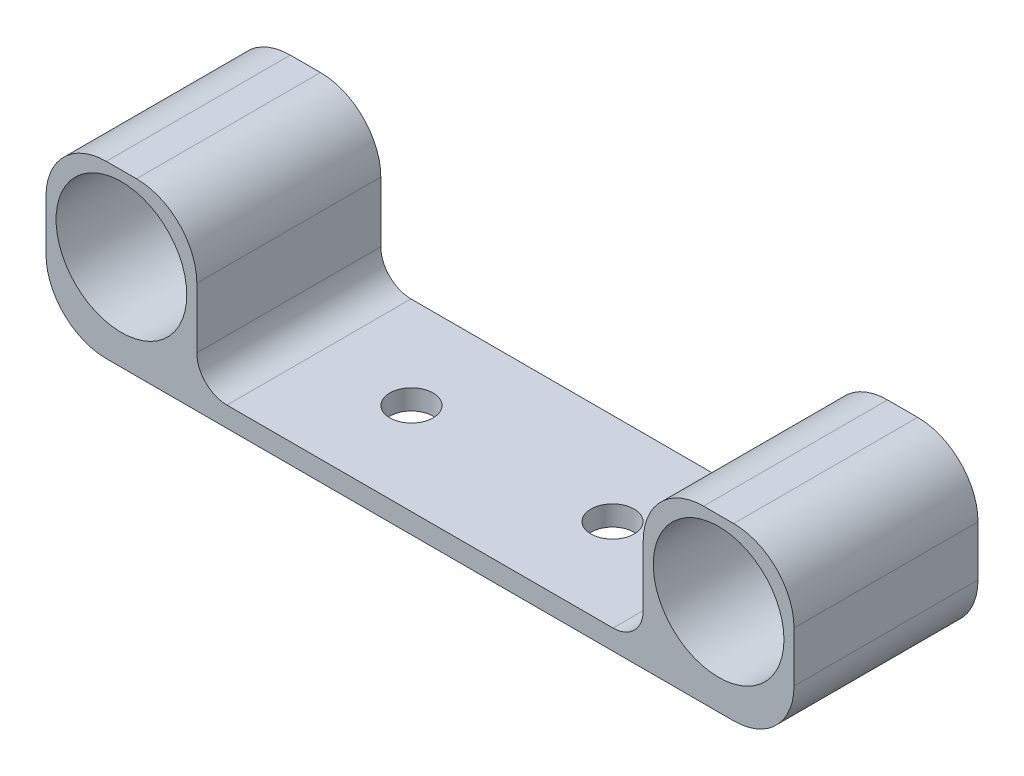
ISO-10303-21;
HEADER;
FILE_DESCRIPTION(('STEP AP214'),'2;1');
FILE_NAME('part.step','',(''),(''),'','','');
FILE_SCHEMA(('AUTOMOTIVE_DESIGN { 1 0 10303 214 1 1 1 1 }'));
ENDSEC;
DATA;
#1=APPLICATION_CONTEXT('core data for automotive mechanical design processes');
#2=APPLICATION_PROTOCOL_DEFINITION('international standard','automotive_design',2000,#1);
#3=PRODUCT_CONTEXT('',#1,'mechanical');
#4=PRODUCT('Part','Part','',(#3));
#5=PRODUCT_RELATED_PRODUCT_CATEGORY('part','',(#4));
#6=PRODUCT_DEFINITION_FORMATION('','',#4);
#7=PRODUCT_DEFINITION_CONTEXT('part definition',#1,'design');
#8=PRODUCT_DEFINITION('design','',#6,#7);
#9=PRODUCT_DEFINITION_SHAPE('','',#8);
#10=(LENGTH_UNIT() NAMED_UNIT(*) SI_UNIT(.MILLI.,.METRE.));
#11=(NAMED_UNIT(*) PLANE_ANGLE_UNIT() SI_UNIT($,.RADIAN.));
#12=(NAMED_UNIT(*) SI_UNIT($,.STERADIAN.) SOLID_ANGLE_UNIT());
#13=UNCERTAINTY_MEASURE_WITH_UNIT(LENGTH_MEASURE(1.E-05),#10,'distance_accuracy_value','');
#14=(GEOMETRIC_REPRESENTATION_CONTEXT(3) GLOBAL_UNCERTAINTY_ASSIGNED_CONTEXT((#13)) GLOBAL_UNIT_ASSIGNED_CONTEXT((#10,
#11,#12)) REPRESENTATION_CONTEXT('',''));
#15=CARTESIAN_POINT('',(0.,0.,0.));
#16=DIRECTION('',(0.,0.,1.));
#17=DIRECTION('',(1.,0.,0.));
#18=AXIS2_PLACEMENT_3D('',#15,#16,#17);
#19=CARTESIAN_POINT('',(0.,2.,0.));
#20=DIRECTION('',(0.,1.,0.));
#21=DIRECTION('',(0.,0.,1.));
#22=AXIS2_PLACEMENT_3D('',#19,#20,#21);
#23=PLANE('',#22);
#24=CARTESIAN_POINT('',(32.2,2.,-9.15));
#25=DIRECTION('',(0.,1.,0.));
#26=DIRECTION('',(0.,0.,1.));
#27=AXIS2_PLACEMENT_3D('',#24,#25,#26);
#28=CIRCLE('',#27,2.15);
#29=CARTESIAN_POINT('',(32.2,2.,-7.));
#30=VERTEX_POINT('',#29);
#31=EDGE_CURVE('E316',#30,#30,#28,.T.);
#32=ORIENTED_EDGE('',*,*,#31,.F.);
#33=EDGE_LOOP('',(#32));
#34=FACE_BOUND('',#33,.T.);
#35=CARTESIAN_POINT('',(12.2,2.,-9.15));
#36=DIRECTION('',(0.,1.,0.));
#37=DIRECTION('',(0.,0.,1.));
#38=AXIS2_PLACEMENT_3D('',#35,#36,#37);
#39=CIRCLE('',#38,2.15);
#40=CARTESIAN_POINT('',(12.2,2.,-7.));
#41=VERTEX_POINT('',#40);
#42=EDGE_CURVE('E326',#41,#41,#39,.T.);
#43=ORIENTED_EDGE('',*,*,#42,.F.);
#44=EDGE_LOOP('',(#43));
#45=FACE_BOUND('',#44,.T.);
#46=DIRECTION('',(-1.,0.,0.));
#47=VECTOR('',#46,1.);
#48=CARTESIAN_POINT('',(0.,2.,0.));
#49=LINE('',#48,#47);
#50=CARTESIAN_POINT('',(41.4,2.,0.));
#51=VERTEX_POINT('',#50);
#52=CARTESIAN_POINT('',(3.,2.,0.));
#53=VERTEX_POINT('',#52);
#54=EDGE_CURVE('E308',#51,#53,#49,.T.);
#55=ORIENTED_EDGE('',*,*,#54,.F.);
#56=DIRECTION('',(0.,0.,1.));
#57=VECTOR('',#56,1.);
#58=CARTESIAN_POINT('',(41.4,2.,-18.3));
#59=LINE('',#58,#57);
#60=CARTESIAN_POINT('',(41.4,2.,-18.3));
#61=VERTEX_POINT('',#60);
#62=EDGE_CURVE('E274',#51,#61,#59,.F.);
#63=ORIENTED_EDGE('',*,*,#62,.T.);
#64=DIRECTION('',(-1.,0.,0.));
#65=VECTOR('',#64,1.);
#66=CARTESIAN_POINT('',(0.,2.,-18.3));
#67=LINE('',#66,#65);
#68=CARTESIAN_POINT('',(3.,2.,-18.3));
#69=VERTEX_POINT('',#68);
#70=EDGE_CURVE('E291',#61,#69,#67,.T.);
#71=ORIENTED_EDGE('',*,*,#70,.T.);
#72=DIRECTION('',(0.,0.,1.));
#73=VECTOR('',#72,1.);
#74=CARTESIAN_POINT('',(3.,2.,0.));
#75=LINE('',#74,#73);
#76=EDGE_CURVE('E270',#69,#53,#75,.T.);
#77=ORIENTED_EDGE('',*,*,#76,.T.);
#78=EDGE_LOOP('',(#55,#63,#71,#77));
#79=FACE_BOUND('',#78,.T.);
#80=ADVANCED_FACE('F49',(#34,#45,#79),#23,.T.);
#81=CARTESIAN_POINT('',(-15.,2.,0.));
#82=DIRECTION('',(-1.,0.,0.));
#83=DIRECTION('',(0.,0.,1.));
#84=AXIS2_PLACEMENT_3D('',#81,#82,#83);
#85=PLANE('',#84);
#86=DIRECTION('',(0.,-1.,0.));
#87=VECTOR('',#86,1.);
#88=CARTESIAN_POINT('',(-15.,2.,-18.3));
#89=LINE('',#88,#87);
#90=CARTESIAN_POINT('',(-15.,11.,-18.3));
#91=VERTEX_POINT('',#90);
#92=CARTESIAN_POINT('',(-15.,6.,-18.3));
#93=VERTEX_POINT('',#92);
#94=EDGE_CURVE('E187',#91,#93,#89,.T.);
#95=ORIENTED_EDGE('',*,*,#94,.T.);
#96=DIRECTION('',(0.,0.,-1.));
#97=VECTOR('',#96,1.);
#98=CARTESIAN_POINT('',(-15.,6.,0.));
#99=LINE('',#98,#97);
#100=CARTESIAN_POINT('',(-15.,6.,0.));
#101=VERTEX_POINT('',#100);
#102=EDGE_CURVE('E253',#93,#101,#99,.F.);
#103=ORIENTED_EDGE('',*,*,#102,.T.);
#104=DIRECTION('',(0.,-1.,0.));
#105=VECTOR('',#104,1.);
#106=CARTESIAN_POINT('',(-15.,2.,0.));
#107=LINE('',#106,#105);
#108=CARTESIAN_POINT('',(-15.,11.,0.));
#109=VERTEX_POINT('',#108);
#110=EDGE_CURVE('E193',#109,#101,#107,.T.);
#111=ORIENTED_EDGE('',*,*,#110,.F.);
#112=DIRECTION('',(0.,0.,-1.));
#113=VECTOR('',#112,1.);
#114=CARTESIAN_POINT('',(-15.,11.,0.));
#115=LINE('',#114,#113);
#116=EDGE_CURVE('E249',#109,#91,#115,.T.);
#117=ORIENTED_EDGE('',*,*,#116,.T.);
#118=EDGE_LOOP('',(#95,#103,#111,#117));
#119=FACE_BOUND('',#118,.T.);
#120=ADVANCED_FACE('F358',(#119),#85,.T.);
#121=CARTESIAN_POINT('',(0.,2.,0.));
#122=DIRECTION('',(0.,0.,1.));
#123=DIRECTION('',(1.,0.,0.));
#124=AXIS2_PLACEMENT_3D('',#121,#122,#123);
#125=PLANE('',#124);
#126=CARTESIAN_POINT('',(-7.5,9.5,0.));
#127=DIRECTION('',(0.,0.,1.));
#128=DIRECTION('',(1.,0.,0.));
#129=AXIS2_PLACEMENT_3D('',#126,#127,#128);
#130=CIRCLE('',#129,6.5);
#131=CARTESIAN_POINT('',(-0.999999999999999,9.5,0.));
#132=VERTEX_POINT('',#131);
#133=EDGE_CURVE('E670',#132,#132,#130,.T.);
#134=ORIENTED_EDGE('',*,*,#133,.F.);
#135=EDGE_LOOP('',(#134));
#136=FACE_BOUND('',#135,.T.);
#137=CARTESIAN_POINT('',(51.9,9.5,0.));
#138=DIRECTION('',(0.,0.,1.));
#139=DIRECTION('',(1.,0.,0.));
#140=AXIS2_PLACEMENT_3D('',#137,#138,#139);
#141=CIRCLE('',#140,6.5);
#142=CARTESIAN_POINT('',(58.4,9.5,0.));
#143=VERTEX_POINT('',#142);
#144=EDGE_CURVE('E666',#143,#143,#141,.T.);
#145=ORIENTED_EDGE('',*,*,#144,.F.);
#146=EDGE_LOOP('',(#145));
#147=FACE_BOUND('',#146,.T.);
#148=DIRECTION('',(-1.,0.,0.));
#149=VECTOR('',#148,1.);
#150=CARTESIAN_POINT('',(0.,0.,0.));
#151=LINE('',#150,#149);
#152=CARTESIAN_POINT('',(53.4,0.,0.));
#153=VERTEX_POINT('',#152);
#154=CARTESIAN_POINT('',(-9.,0.,0.));
#155=VERTEX_POINT('',#154);
#156=EDGE_CURVE('E301',#153,#155,#151,.T.);
#157=ORIENTED_EDGE('',*,*,#156,.F.);
#158=CARTESIAN_POINT('',(53.4,6.,0.));
#159=DIRECTION('',(0.,0.,1.));
#160=DIRECTION('',(1.,0.,0.));
#161=AXIS2_PLACEMENT_3D('',#158,#159,#160);
#162=CIRCLE('',#161,6.);
#163=CARTESIAN_POINT('',(59.4,6.,0.));
#164=VERTEX_POINT('',#163);
#165=EDGE_CURVE('E236',#153,#164,#162,.T.);
#166=ORIENTED_EDGE('',*,*,#165,.T.);
#167=DIRECTION('',(0.,-1.,0.));
#168=VECTOR('',#167,1.);
#169=CARTESIAN_POINT('',(59.4,2.,0.));
#170=LINE('',#169,#168);
#171=CARTESIAN_POINT('',(59.4,11.,0.));
#172=VERTEX_POINT('',#171);
#173=EDGE_CURVE('E186',#172,#164,#170,.T.);
#174=ORIENTED_EDGE('',*,*,#173,.F.);
#175=CARTESIAN_POINT('',(53.4,11.,0.));
#176=DIRECTION('',(0.,0.,1.));
#177=DIRECTION('',(1.,0.,0.));
#178=AXIS2_PLACEMENT_3D('',#175,#176,#177);
#179=CIRCLE('',#178,6.);
#180=CARTESIAN_POINT('',(53.4,17.,0.));
#181=VERTEX_POINT('',#180);
#182=EDGE_CURVE('E191',#172,#181,#179,.T.);
#183=ORIENTED_EDGE('',*,*,#182,.T.);
#184=DIRECTION('',(1.,0.,0.));
#185=VECTOR('',#184,1.);
#186=CARTESIAN_POINT('',(0.,17.,0.));
#187=LINE('',#186,#185);
#188=CARTESIAN_POINT('',(50.4,17.,0.));
#189=VERTEX_POINT('',#188);
#190=EDGE_CURVE('E387',#189,#181,#187,.T.);
#191=ORIENTED_EDGE('',*,*,#190,.F.);
#192=CARTESIAN_POINT('',(50.4,11.,0.));
#193=DIRECTION('',(0.,0.,1.));
#194=DIRECTION('',(1.,0.,0.));
#195=AXIS2_PLACEMENT_3D('',#192,#193,#194);
#196=CIRCLE('',#195,6.);
#197=CARTESIAN_POINT('',(44.4,11.,0.));
#198=VERTEX_POINT('',#197);
#199=EDGE_CURVE('E231',#189,#198,#196,.T.);
#200=ORIENTED_EDGE('',*,*,#199,.T.);
#201=DIRECTION('',(0.,-1.,0.));
#202=VECTOR('',#201,1.);
#203=CARTESIAN_POINT('',(44.4,17.,0.));
#204=LINE('',#203,#202);
#205=CARTESIAN_POINT('',(44.4,5.,0.));
#206=VERTEX_POINT('',#205);
#207=EDGE_CURVE('E302',#198,#206,#204,.T.);
#208=ORIENTED_EDGE('',*,*,#207,.T.);
#209=CARTESIAN_POINT('',(41.4,5.,0.));
#210=DIRECTION('',(0.,0.,1.));
#211=DIRECTION('',(1.,0.,0.));
#212=AXIS2_PLACEMENT_3D('',#209,#210,#211);
#213=CIRCLE('',#212,3.);
#214=EDGE_CURVE('E279',#206,#51,#213,.F.);
#215=ORIENTED_EDGE('',*,*,#214,.T.);
#216=ORIENTED_EDGE('',*,*,#54,.T.);
#217=CARTESIAN_POINT('',(3.,5.,0.));
#218=DIRECTION('',(0.,0.,1.));
#219=DIRECTION('',(1.,0.,0.));
#220=AXIS2_PLACEMENT_3D('',#217,#218,#219);
#221=CIRCLE('',#220,3.);
#222=CARTESIAN_POINT('',(0.,5.,0.));
#223=VERTEX_POINT('',#222);
#224=EDGE_CURVE('E58',#53,#223,#221,.F.);
#225=ORIENTED_EDGE('',*,*,#224,.T.);
#226=DIRECTION('',(0.,-1.,0.));
#227=VECTOR('',#226,1.);
#228=CARTESIAN_POINT('',(0.,17.,0.));
#229=LINE('',#228,#227);
#230=CARTESIAN_POINT('',(0.,11.,0.));
#231=VERTEX_POINT('',#230);
#232=EDGE_CURVE('E379',#231,#223,#229,.T.);
#233=ORIENTED_EDGE('',*,*,#232,.F.);
#234=CARTESIAN_POINT('',(-6.,11.,0.));
#235=DIRECTION('',(0.,0.,1.));
#236=DIRECTION('',(1.,0.,0.));
#237=AXIS2_PLACEMENT_3D('',#234,#235,#236);
#238=CIRCLE('',#237,6.);
#239=CARTESIAN_POINT('',(-6.,17.,0.));
#240=VERTEX_POINT('',#239);
#241=EDGE_CURVE('E225',#231,#240,#238,.T.);
#242=ORIENTED_EDGE('',*,*,#241,.T.);
#243=DIRECTION('',(-1.,0.,0.));
#244=VECTOR('',#243,1.);
#245=CARTESIAN_POINT('',(0.,17.,0.));
#246=LINE('',#245,#244);
#247=CARTESIAN_POINT('',(-9.,17.,0.));
#248=VERTEX_POINT('',#247);
#249=EDGE_CURVE('E375',#240,#248,#246,.T.);
#250=ORIENTED_EDGE('',*,*,#249,.T.);
#251=CARTESIAN_POINT('',(-9.,11.,0.));
#252=DIRECTION('',(0.,0.,1.));
#253=DIRECTION('',(1.,0.,0.));
#254=AXIS2_PLACEMENT_3D('',#251,#252,#253);
#255=CIRCLE('',#254,6.);
#256=EDGE_CURVE('E222',#248,#109,#255,.T.);
#257=ORIENTED_EDGE('',*,*,#256,.T.);
#258=ORIENTED_EDGE('',*,*,#110,.T.);
#259=CARTESIAN_POINT('',(-9.,6.,0.));
#260=DIRECTION('',(0.,0.,1.));
#261=DIRECTION('',(1.,0.,0.));
#262=AXIS2_PLACEMENT_3D('',#259,#260,#261);
#263=CIRCLE('',#262,6.);
#264=EDGE_CURVE('E228',#101,#155,#263,.T.);
#265=ORIENTED_EDGE('',*,*,#264,.T.);
#266=EDGE_LOOP('',(#157,#166,#174,#183,#191,#200,#208,#215,#216,#225,#233,#242,#250,#257,#258,#265));
#267=FACE_BOUND('',#266,.T.);
#268=ADVANCED_FACE('F307',(#136,#147,#267),#125,.T.);
#269=CARTESIAN_POINT('',(59.4,2.,0.));
#270=DIRECTION('',(-1.,0.,0.));
#271=DIRECTION('',(0.,0.,1.));
#272=AXIS2_PLACEMENT_3D('',#269,#270,#271);
#273=PLANE('',#272);
#274=ORIENTED_EDGE('',*,*,#173,.T.);
#275=DIRECTION('',(0.,0.,-1.));
#276=VECTOR('',#275,1.);
#277=CARTESIAN_POINT('',(59.4,6.,0.));
#278=LINE('',#277,#276);
#279=CARTESIAN_POINT('',(59.4,6.,-18.3));
#280=VERTEX_POINT('',#279);
#281=EDGE_CURVE('E184',#164,#280,#278,.T.);
#282=ORIENTED_EDGE('',*,*,#281,.T.);
#283=DIRECTION('',(0.,-1.,0.));
#284=VECTOR('',#283,1.);
#285=CARTESIAN_POINT('',(59.4,2.,-18.3));
#286=LINE('',#285,#284);
#287=CARTESIAN_POINT('',(59.4,11.,-18.3));
#288=VERTEX_POINT('',#287);
#289=EDGE_CURVE('E166',#288,#280,#286,.T.);
#290=ORIENTED_EDGE('',*,*,#289,.F.);
#291=DIRECTION('',(0.,0.,-1.));
#292=VECTOR('',#291,1.);
#293=CARTESIAN_POINT('',(59.4,11.,0.));
#294=LINE('',#293,#292);
#295=EDGE_CURVE('E181',#288,#172,#294,.F.);
#296=ORIENTED_EDGE('',*,*,#295,.T.);
#297=EDGE_LOOP('',(#274,#282,#290,#296));
#298=FACE_BOUND('',#297,.T.);
#299=ADVANCED_FACE('F180',(#298),#273,.F.);
#300=CARTESIAN_POINT('',(32.2,2.,-9.15));
#301=DIRECTION('',(0.,-1.,0.));
#302=DIRECTION('',(0.,0.,-1.));
#303=AXIS2_PLACEMENT_3D('',#300,#301,#302);
#304=CYLINDRICAL_SURFACE('',#303,2.15);
#305=ORIENTED_EDGE('',*,*,#31,.T.);
#306=EDGE_LOOP('',(#305));
#307=FACE_BOUND('',#306,.T.);
#308=CARTESIAN_POINT('',(32.2,0.,-9.15));
#309=DIRECTION('',(0.,1.,0.));
#310=DIRECTION('',(0.,0.,1.));
#311=AXIS2_PLACEMENT_3D('',#308,#309,#310);
#312=CIRCLE('',#311,2.15);
#313=CARTESIAN_POINT('',(32.2,0.,-7.));
#314=VERTEX_POINT('',#313);
#315=EDGE_CURVE('E319',#314,#314,#312,.T.);
#316=ORIENTED_EDGE('',*,*,#315,.F.);
#317=EDGE_LOOP('',(#316));
#318=FACE_BOUND('',#317,.T.);
#319=ADVANCED_FACE('F429',(#307,#318),#304,.F.);
#320=CARTESIAN_POINT('',(0.,2.,-18.3));
#321=DIRECTION('',(0.,0.,1.));
#322=DIRECTION('',(1.,0.,0.));
#323=AXIS2_PLACEMENT_3D('',#320,#321,#322);
#324=PLANE('',#323);
#325=ORIENTED_EDGE('',*,*,#289,.T.);
#326=CARTESIAN_POINT('',(53.4,6.,-18.3));
#327=DIRECTION('',(0.,0.,1.));
#328=DIRECTION('',(1.,0.,0.));
#329=AXIS2_PLACEMENT_3D('',#326,#327,#328);
#330=CIRCLE('',#329,6.);
#331=CARTESIAN_POINT('',(53.4,0.,-18.3));
#332=VERTEX_POINT('',#331);
#333=EDGE_CURVE('E174',#280,#332,#330,.F.);
#334=ORIENTED_EDGE('',*,*,#333,.T.);
#335=DIRECTION('',(-1.,0.,0.));
#336=VECTOR('',#335,1.);
#337=CARTESIAN_POINT('',(0.,0.,-18.3));
#338=LINE('',#337,#336);
#339=CARTESIAN_POINT('',(-9.,0.,-18.3));
#340=VERTEX_POINT('',#339);
#341=EDGE_CURVE('E333',#332,#340,#338,.T.);
#342=ORIENTED_EDGE('',*,*,#341,.T.);
#343=CARTESIAN_POINT('',(-9.,6.,-18.3));
#344=DIRECTION('',(0.,0.,1.));
#345=DIRECTION('',(1.,0.,0.));
#346=AXIS2_PLACEMENT_3D('',#343,#344,#345);
#347=CIRCLE('',#346,6.);
#348=EDGE_CURVE('E208',#340,#93,#347,.F.);
#349=ORIENTED_EDGE('',*,*,#348,.T.);
#350=ORIENTED_EDGE('',*,*,#94,.F.);
#351=CARTESIAN_POINT('',(-9.,11.,-18.3));
#352=DIRECTION('',(0.,0.,1.));
#353=DIRECTION('',(1.,0.,0.));
#354=AXIS2_PLACEMENT_3D('',#351,#352,#353);
#355=CIRCLE('',#354,6.);
#356=CARTESIAN_POINT('',(-9.,17.,-18.3));
#357=VERTEX_POINT('',#356);
#358=EDGE_CURVE('E197',#91,#357,#355,.F.);
#359=ORIENTED_EDGE('',*,*,#358,.T.);
#360=DIRECTION('',(-1.,0.,0.));
#361=VECTOR('',#360,1.);
#362=CARTESIAN_POINT('',(0.,17.,-18.3));
#363=LINE('',#362,#361);
#364=CARTESIAN_POINT('',(-6.,17.,-18.3));
#365=VERTEX_POINT('',#364);
#366=EDGE_CURVE('E367',#365,#357,#363,.T.);
#367=ORIENTED_EDGE('',*,*,#366,.F.);
#368=CARTESIAN_POINT('',(-6.,11.,-18.3));
#369=DIRECTION('',(0.,0.,1.));
#370=DIRECTION('',(1.,0.,0.));
#371=AXIS2_PLACEMENT_3D('',#368,#369,#370);
#372=CIRCLE('',#371,6.);
#373=CARTESIAN_POINT('',(0.,11.,-18.3));
#374=VERTEX_POINT('',#373);
#375=EDGE_CURVE('E205',#365,#374,#372,.F.);
#376=ORIENTED_EDGE('',*,*,#375,.T.);
#377=DIRECTION('',(0.,-1.,0.));
#378=VECTOR('',#377,1.);
#379=CARTESIAN_POINT('',(0.,17.,-18.3));
#380=LINE('',#379,#378);
#381=CARTESIAN_POINT('',(0.,5.,-18.3));
#382=VERTEX_POINT('',#381);
#383=EDGE_CURVE('E374',#374,#382,#380,.T.);
#384=ORIENTED_EDGE('',*,*,#383,.T.);
#385=CARTESIAN_POINT('',(3.,5.,-18.3));
#386=DIRECTION('',(0.,0.,1.));
#387=DIRECTION('',(1.,0.,0.));
#388=AXIS2_PLACEMENT_3D('',#385,#386,#387);
#389=CIRCLE('',#388,3.);
#390=EDGE_CURVE('E12',#382,#69,#389,.T.);
#391=ORIENTED_EDGE('',*,*,#390,.T.);
#392=ORIENTED_EDGE('',*,*,#70,.F.);
#393=CARTESIAN_POINT('',(41.4,5.,-18.3));
#394=DIRECTION('',(0.,0.,1.));
#395=DIRECTION('',(1.,0.,0.));
#396=AXIS2_PLACEMENT_3D('',#393,#394,#395);
#397=CIRCLE('',#396,3.);
#398=CARTESIAN_POINT('',(44.4,5.,-18.3));
#399=VERTEX_POINT('',#398);
#400=EDGE_CURVE('E282',#61,#399,#397,.T.);
#401=ORIENTED_EDGE('',*,*,#400,.T.);
#402=DIRECTION('',(0.,-1.,0.));
#403=VECTOR('',#402,1.);
#404=CARTESIAN_POINT('',(44.4,17.,-18.3));
#405=LINE('',#404,#403);
#406=CARTESIAN_POINT('',(44.4,11.,-18.3));
#407=VERTEX_POINT('',#406);
#408=EDGE_CURVE('E289',#407,#399,#405,.T.);
#409=ORIENTED_EDGE('',*,*,#408,.F.);
#410=CARTESIAN_POINT('',(50.4,11.,-18.3));
#411=DIRECTION('',(0.,0.,1.));
#412=DIRECTION('',(1.,0.,0.));
#413=AXIS2_PLACEMENT_3D('',#410,#411,#412);
#414=CIRCLE('',#413,6.);
#415=CARTESIAN_POINT('',(50.4,17.,-18.3));
#416=VERTEX_POINT('',#415);
#417=EDGE_CURVE('E175',#407,#416,#414,.F.);
#418=ORIENTED_EDGE('',*,*,#417,.T.);
#419=DIRECTION('',(1.,0.,0.));
#420=VECTOR('',#419,1.);
#421=CARTESIAN_POINT('',(0.,17.,-18.3));
#422=LINE('',#421,#420);
#423=CARTESIAN_POINT('',(53.4,17.,-18.3));
#424=VERTEX_POINT('',#423);
#425=EDGE_CURVE('E168',#416,#424,#422,.T.);
#426=ORIENTED_EDGE('',*,*,#425,.T.);
#427=CARTESIAN_POINT('',(53.4,11.,-18.3));
#428=DIRECTION('',(0.,0.,1.));
#429=DIRECTION('',(1.,0.,0.));
#430=AXIS2_PLACEMENT_3D('',#427,#428,#429);
#431=CIRCLE('',#430,6.);
#432=EDGE_CURVE('E163',#424,#288,#431,.F.);
#433=ORIENTED_EDGE('',*,*,#432,.T.);
#434=EDGE_LOOP('',(#325,#334,#342,#349,#350,#359,#367,#376,#384,#391,#392,#401,#409,#418,#426,#433));
#435=FACE_BOUND('',#434,.T.);
#436=ADVANCED_FACE('F165',(#435),#324,.F.);
#437=CARTESIAN_POINT('',(12.2,2.,-9.15));
#438=DIRECTION('',(0.,-1.,0.));
#439=DIRECTION('',(0.,0.,-1.));
#440=AXIS2_PLACEMENT_3D('',#437,#438,#439);
#441=CYLINDRICAL_SURFACE('',#440,2.15);
#442=ORIENTED_EDGE('',*,*,#42,.T.);
#443=EDGE_LOOP('',(#442));
#444=FACE_BOUND('',#443,.T.);
#445=CARTESIAN_POINT('',(12.2,0.,-9.15));
#446=DIRECTION('',(0.,1.,0.));
#447=DIRECTION('',(0.,0.,1.));
#448=AXIS2_PLACEMENT_3D('',#445,#446,#447);
#449=CIRCLE('',#448,2.15);
#450=CARTESIAN_POINT('',(12.2,0.,-7.));
#451=VERTEX_POINT('',#450);
#452=EDGE_CURVE('E312',#451,#451,#449,.T.);
#453=ORIENTED_EDGE('',*,*,#452,.F.);
#454=EDGE_LOOP('',(#453));
#455=FACE_BOUND('',#454,.T.);
#456=ADVANCED_FACE('F425',(#444,#455),#441,.F.);
#457=CARTESIAN_POINT('',(0.,0.,0.));
#458=DIRECTION('',(0.,1.,0.));
#459=DIRECTION('',(0.,0.,1.));
#460=AXIS2_PLACEMENT_3D('',#457,#458,#459);
#461=PLANE('',#460);
#462=ORIENTED_EDGE('',*,*,#341,.F.);
#463=DIRECTION('',(0.,0.,-1.));
#464=VECTOR('',#463,1.);
#465=CARTESIAN_POINT('',(53.4,0.,0.));
#466=LINE('',#465,#464);
#467=EDGE_CURVE('E219',#332,#153,#466,.F.);
#468=ORIENTED_EDGE('',*,*,#467,.T.);
#469=ORIENTED_EDGE('',*,*,#156,.T.);
#470=DIRECTION('',(0.,0.,-1.));
#471=VECTOR('',#470,1.);
#472=CARTESIAN_POINT('',(-9.,0.,-18.3));
#473=LINE('',#472,#471);
#474=EDGE_CURVE('E215',#155,#340,#473,.T.);
#475=ORIENTED_EDGE('',*,*,#474,.T.);
#476=EDGE_LOOP('',(#462,#468,#469,#475));
#477=FACE_BOUND('',#476,.T.);
#478=ORIENTED_EDGE('',*,*,#452,.T.);
#479=EDGE_LOOP('',(#478));
#480=FACE_BOUND('',#479,.T.);
#481=ORIENTED_EDGE('',*,*,#315,.T.);
#482=EDGE_LOOP('',(#481));
#483=FACE_BOUND('',#482,.T.);
#484=ADVANCED_FACE('F349',(#477,#480,#483),#461,.F.);
#485=CARTESIAN_POINT('',(44.4,17.,0.));
#486=DIRECTION('',(-1.,0.,0.));
#487=DIRECTION('',(0.,0.,1.));
#488=AXIS2_PLACEMENT_3D('',#485,#486,#487);
#489=PLANE('',#488);
#490=ORIENTED_EDGE('',*,*,#408,.T.);
#491=DIRECTION('',(0.,0.,1.));
#492=VECTOR('',#491,1.);
#493=CARTESIAN_POINT('',(44.4,5.,0.));
#494=LINE('',#493,#492);
#495=EDGE_CURVE('E266',#399,#206,#494,.T.);
#496=ORIENTED_EDGE('',*,*,#495,.T.);
#497=ORIENTED_EDGE('',*,*,#207,.F.);
#498=DIRECTION('',(0.,0.,-1.));
#499=VECTOR('',#498,1.);
#500=CARTESIAN_POINT('',(44.4,11.,0.));
#501=LINE('',#500,#499);
#502=EDGE_CURVE('E245',#198,#407,#501,.T.);
#503=ORIENTED_EDGE('',*,*,#502,.T.);
#504=EDGE_LOOP('',(#490,#496,#497,#503));
#505=FACE_BOUND('',#504,.T.);
#506=ADVANCED_FACE('F296',(#505),#489,.T.);
#507=CARTESIAN_POINT('',(0.,17.,0.));
#508=DIRECTION('',(0.,1.,0.));
#509=DIRECTION('',(0.,0.,1.));
#510=AXIS2_PLACEMENT_3D('',#507,#508,#509);
#511=PLANE('',#510);
#512=ORIENTED_EDGE('',*,*,#190,.T.);
#513=DIRECTION('',(0.,0.,-1.));
#514=VECTOR('',#513,1.);
#515=CARTESIAN_POINT('',(53.4,17.,-18.3));
#516=LINE('',#515,#514);
#517=EDGE_CURVE('E242',#181,#424,#516,.T.);
#518=ORIENTED_EDGE('',*,*,#517,.T.);
#519=ORIENTED_EDGE('',*,*,#425,.F.);
#520=DIRECTION('',(0.,0.,-1.));
#521=VECTOR('',#520,1.);
#522=CARTESIAN_POINT('',(50.4,17.,0.));
#523=LINE('',#522,#521);
#524=EDGE_CURVE('E239',#416,#189,#523,.F.);
#525=ORIENTED_EDGE('',*,*,#524,.T.);
#526=EDGE_LOOP('',(#512,#518,#519,#525));
#527=FACE_BOUND('',#526,.T.);
#528=ADVANCED_FACE('F395',(#527),#511,.T.);
#529=CARTESIAN_POINT('',(0.,17.,0.));
#530=DIRECTION('',(-1.,0.,0.));
#531=DIRECTION('',(0.,0.,1.));
#532=AXIS2_PLACEMENT_3D('',#529,#530,#531);
#533=PLANE('',#532);
#534=ORIENTED_EDGE('',*,*,#232,.T.);
#535=DIRECTION('',(0.,0.,1.));
#536=VECTOR('',#535,1.);
#537=CARTESIAN_POINT('',(0.,5.,0.));
#538=LINE('',#537,#536);
#539=EDGE_CURVE('E71',#223,#382,#538,.F.);
#540=ORIENTED_EDGE('',*,*,#539,.T.);
#541=ORIENTED_EDGE('',*,*,#383,.F.);
#542=DIRECTION('',(0.,0.,-1.));
#543=VECTOR('',#542,1.);
#544=CARTESIAN_POINT('',(0.,11.,0.));
#545=LINE('',#544,#543);
#546=EDGE_CURVE('E263',#374,#231,#545,.F.);
#547=ORIENTED_EDGE('',*,*,#546,.T.);
#548=EDGE_LOOP('',(#534,#540,#541,#547));
#549=FACE_BOUND('',#548,.T.);
#550=ADVANCED_FACE('F464',(#549),#533,.F.);
#551=CARTESIAN_POINT('',(0.,17.,0.));
#552=DIRECTION('',(0.,1.,0.));
#553=DIRECTION('',(0.,0.,1.));
#554=AXIS2_PLACEMENT_3D('',#551,#552,#553);
#555=PLANE('',#554);
#556=ORIENTED_EDGE('',*,*,#249,.F.);
#557=DIRECTION('',(0.,0.,-1.));
#558=VECTOR('',#557,1.);
#559=CARTESIAN_POINT('',(-6.,17.,-18.3));
#560=LINE('',#559,#558);
#561=EDGE_CURVE('E259',#240,#365,#560,.T.);
#562=ORIENTED_EDGE('',*,*,#561,.T.);
#563=ORIENTED_EDGE('',*,*,#366,.T.);
#564=DIRECTION('',(0.,0.,-1.));
#565=VECTOR('',#564,1.);
#566=CARTESIAN_POINT('',(-9.,17.,0.));
#567=LINE('',#566,#565);
#568=EDGE_CURVE('E256',#357,#248,#567,.F.);
#569=ORIENTED_EDGE('',*,*,#568,.T.);
#570=EDGE_LOOP('',(#556,#562,#563,#569));
#571=FACE_BOUND('',#570,.T.);
#572=ADVANCED_FACE('F370',(#571),#555,.T.);
#573=CARTESIAN_POINT('',(51.9,9.5,-36.6847763108503));
#574=DIRECTION('',(0.,0.,1.));
#575=DIRECTION('',(1.,0.,0.));
#576=AXIS2_PLACEMENT_3D('',#573,#574,#575);
#577=CYLINDRICAL_SURFACE('',#576,6.5);
#578=CARTESIAN_POINT('',(51.9,9.5,-12.315));
#579=DIRECTION('',(0.,0.,1.));
#580=DIRECTION('',(1.,0.,0.));
#581=AXIS2_PLACEMENT_3D('',#578,#579,#580);
#582=CIRCLE('',#581,6.5);
#583=CARTESIAN_POINT('',(58.4,9.5,-12.315));
#584=VERTEX_POINT('',#583);
#585=EDGE_CURVE('E664',#584,#584,#582,.F.);
#586=ORIENTED_EDGE('',*,*,#585,.T.);
#587=EDGE_LOOP('',(#586));
#588=FACE_BOUND('',#587,.T.);
#589=ORIENTED_EDGE('',*,*,#144,.T.);
#590=EDGE_LOOP('',(#589));
#591=FACE_BOUND('',#590,.T.);
#592=ADVANCED_FACE('F456',(#588,#591),#577,.F.);
#593=CARTESIAN_POINT('',(0.,2.,-12.315));
#594=DIRECTION('',(0.,0.,1.));
#595=DIRECTION('',(1.,0.,0.));
#596=AXIS2_PLACEMENT_3D('',#593,#594,#595);
#597=PLANE('',#596);
#598=ORIENTED_EDGE('',*,*,#585,.F.);
#599=EDGE_LOOP('',(#598));
#600=FACE_BOUND('',#599,.T.);
#601=ADVANCED_FACE('F451',(#600),#597,.T.);
#602=CARTESIAN_POINT('',(-7.5,9.5,-36.6847763108503));
#603=DIRECTION('',(0.,0.,1.));
#604=DIRECTION('',(1.,0.,0.));
#605=AXIS2_PLACEMENT_3D('',#602,#603,#604);
#606=CYLINDRICAL_SURFACE('',#605,6.5);
#607=CARTESIAN_POINT('',(-7.5,9.5,-12.315));
#608=DIRECTION('',(0.,0.,1.));
#609=DIRECTION('',(1.,0.,0.));
#610=AXIS2_PLACEMENT_3D('',#607,#608,#609);
#611=CIRCLE('',#610,6.5);
#612=CARTESIAN_POINT('',(-0.999999999999999,9.5,-12.315));
#613=VERTEX_POINT('',#612);
#614=EDGE_CURVE('E381',#613,#613,#611,.F.);
#615=ORIENTED_EDGE('',*,*,#614,.T.);
#616=EDGE_LOOP('',(#615));
#617=FACE_BOUND('',#616,.T.);
#618=ORIENTED_EDGE('',*,*,#133,.T.);
#619=EDGE_LOOP('',(#618));
#620=FACE_BOUND('',#619,.T.);
#621=ADVANCED_FACE('F445',(#617,#620),#606,.F.);
#622=CARTESIAN_POINT('',(0.,2.,-12.315));
#623=DIRECTION('',(0.,0.,1.));
#624=DIRECTION('',(1.,0.,0.));
#625=AXIS2_PLACEMENT_3D('',#622,#623,#624);
#626=PLANE('',#625);
#627=ORIENTED_EDGE('',*,*,#614,.F.);
#628=EDGE_LOOP('',(#627));
#629=FACE_BOUND('',#628,.T.);
#630=ADVANCED_FACE('F440',(#629),#626,.T.);
#631=CARTESIAN_POINT('',(53.4,6.,0.));
#632=DIRECTION('',(0.,0.,-1.));
#633=DIRECTION('',(-1.,0.,0.));
#634=AXIS2_PLACEMENT_3D('',#631,#632,#633);
#635=CYLINDRICAL_SURFACE('',#634,6.);
#636=ORIENTED_EDGE('',*,*,#165,.F.);
#637=ORIENTED_EDGE('',*,*,#467,.F.);
#638=ORIENTED_EDGE('',*,*,#333,.F.);
#639=ORIENTED_EDGE('',*,*,#281,.F.);
#640=EDGE_LOOP('',(#636,#637,#638,#639));
#641=FACE_BOUND('',#640,.T.);
#642=ADVANCED_FACE('F345',(#641),#635,.T.);
#643=CARTESIAN_POINT('',(53.4,11.,0.));
#644=DIRECTION('',(0.,0.,1.));
#645=DIRECTION('',(1.,0.,0.));
#646=AXIS2_PLACEMENT_3D('',#643,#644,#645);
#647=CYLINDRICAL_SURFACE('',#646,6.);
#648=ORIENTED_EDGE('',*,*,#182,.F.);
#649=ORIENTED_EDGE('',*,*,#295,.F.);
#650=ORIENTED_EDGE('',*,*,#432,.F.);
#651=ORIENTED_EDGE('',*,*,#517,.F.);
#652=EDGE_LOOP('',(#648,#649,#650,#651));
#653=FACE_BOUND('',#652,.T.);
#654=ADVANCED_FACE('F190',(#653),#647,.T.);
#655=CARTESIAN_POINT('',(50.4,11.,0.));
#656=DIRECTION('',(0.,0.,-1.));
#657=DIRECTION('',(-1.,0.,0.));
#658=AXIS2_PLACEMENT_3D('',#655,#656,#657);
#659=CYLINDRICAL_SURFACE('',#658,6.);
#660=ORIENTED_EDGE('',*,*,#199,.F.);
#661=ORIENTED_EDGE('',*,*,#524,.F.);
#662=ORIENTED_EDGE('',*,*,#417,.F.);
#663=ORIENTED_EDGE('',*,*,#502,.F.);
#664=EDGE_LOOP('',(#660,#661,#662,#663));
#665=FACE_BOUND('',#664,.T.);
#666=ADVANCED_FACE('F399',(#665),#659,.T.);
#667=CARTESIAN_POINT('',(-9.,6.,0.));
#668=DIRECTION('',(0.,0.,1.));
#669=DIRECTION('',(1.,0.,0.));
#670=AXIS2_PLACEMENT_3D('',#667,#668,#669);
#671=CYLINDRICAL_SURFACE('',#670,6.);
#672=ORIENTED_EDGE('',*,*,#264,.F.);
#673=ORIENTED_EDGE('',*,*,#102,.F.);
#674=ORIENTED_EDGE('',*,*,#348,.F.);
#675=ORIENTED_EDGE('',*,*,#474,.F.);
#676=EDGE_LOOP('',(#672,#673,#674,#675));
#677=FACE_BOUND('',#676,.T.);
#678=ADVANCED_FACE('F354',(#677),#671,.T.);
#679=CARTESIAN_POINT('',(-6.,11.,0.));
#680=DIRECTION('',(0.,0.,1.));
#681=DIRECTION('',(1.,0.,0.));
#682=AXIS2_PLACEMENT_3D('',#679,#680,#681);
#683=CYLINDRICAL_SURFACE('',#682,6.);
#684=ORIENTED_EDGE('',*,*,#241,.F.);
#685=ORIENTED_EDGE('',*,*,#546,.F.);
#686=ORIENTED_EDGE('',*,*,#375,.F.);
#687=ORIENTED_EDGE('',*,*,#561,.F.);
#688=EDGE_LOOP('',(#684,#685,#686,#687));
#689=FACE_BOUND('',#688,.T.);
#690=ADVANCED_FACE('F406',(#689),#683,.T.);
#691=CARTESIAN_POINT('',(-9.,11.,0.));
#692=DIRECTION('',(0.,0.,-1.));
#693=DIRECTION('',(-1.,0.,0.));
#694=AXIS2_PLACEMENT_3D('',#691,#692,#693);
#695=CYLINDRICAL_SURFACE('',#694,6.);
#696=ORIENTED_EDGE('',*,*,#256,.F.);
#697=ORIENTED_EDGE('',*,*,#568,.F.);
#698=ORIENTED_EDGE('',*,*,#358,.F.);
#699=ORIENTED_EDGE('',*,*,#116,.F.);
#700=EDGE_LOOP('',(#696,#697,#698,#699));
#701=FACE_BOUND('',#700,.T.);
#702=ADVANCED_FACE('F363',(#701),#695,.T.);
#703=CARTESIAN_POINT('',(41.4,5.,0.));
#704=DIRECTION('',(0.,0.,-1.));
#705=DIRECTION('',(-1.,0.,0.));
#706=AXIS2_PLACEMENT_3D('',#703,#704,#705);
#707=CYLINDRICAL_SURFACE('',#706,3.);
#708=ORIENTED_EDGE('',*,*,#400,.F.);
#709=ORIENTED_EDGE('',*,*,#62,.F.);
#710=ORIENTED_EDGE('',*,*,#214,.F.);
#711=ORIENTED_EDGE('',*,*,#495,.F.);
#712=EDGE_LOOP('',(#708,#709,#710,#711));
#713=FACE_BOUND('',#712,.T.);
#714=ADVANCED_FACE('F304',(#713),#707,.F.);
#715=CARTESIAN_POINT('',(3.,5.,0.));
#716=DIRECTION('',(0.,0.,1.));
#717=DIRECTION('',(1.,0.,0.));
#718=AXIS2_PLACEMENT_3D('',#715,#716,#717);
#719=CYLINDRICAL_SURFACE('',#718,3.);
#720=ORIENTED_EDGE('',*,*,#390,.F.);
#721=ORIENTED_EDGE('',*,*,#539,.F.);
#722=ORIENTED_EDGE('',*,*,#224,.F.);
#723=ORIENTED_EDGE('',*,*,#76,.F.);
#724=EDGE_LOOP('',(#720,#721,#722,#723));
#725=FACE_BOUND('',#724,.T.);
#726=ADVANCED_FACE('F51',(#725),#719,.F.);
#727=CLOSED_SHELL('',(#80,#120,#268,#299,#319,#436,#456,#484,#506,#528,#550,#572,#592,#601,#621,
#630,#642,#654,#666,#678,#690,#702,#714,#726));
#728=MANIFOLD_SOLID_BREP('B2',#727);
#729=ADVANCED_BREP_SHAPE_REPRESENTATION('',(#18,#728),#14);
#730=SHAPE_DEFINITION_REPRESENTATION(#9,#729);
ENDSEC;
END-ISO-10303-21;
